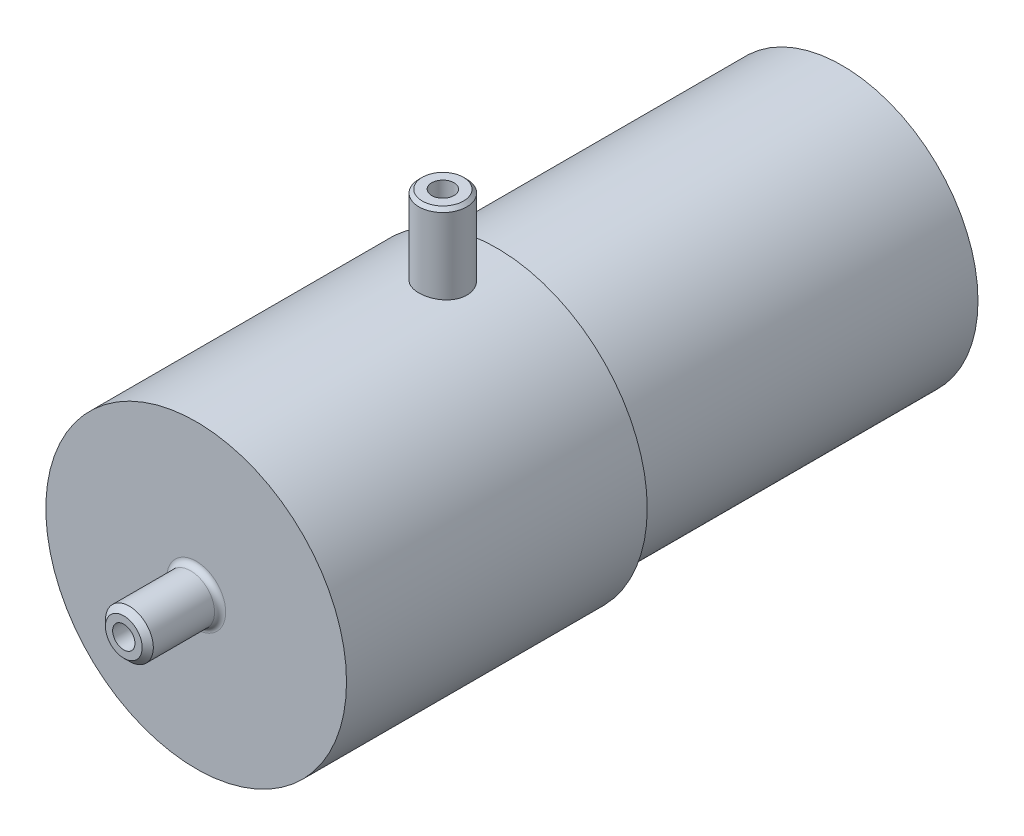
ISO-10303-21;
HEADER;
FILE_DESCRIPTION(('STEP AP214'),'2;1');
FILE_NAME('part.step','',(''),(''),'','','');
FILE_SCHEMA(('AUTOMOTIVE_DESIGN { 1 0 10303 214 1 1 1 1 }'));
ENDSEC;
DATA;
#1=APPLICATION_CONTEXT('core data for automotive mechanical design processes');
#2=APPLICATION_PROTOCOL_DEFINITION('international standard','automotive_design',2000,#1);
#3=PRODUCT_CONTEXT('',#1,'mechanical');
#4=PRODUCT('Part','Part','',(#3));
#5=PRODUCT_RELATED_PRODUCT_CATEGORY('part','',(#4));
#6=PRODUCT_DEFINITION_FORMATION('','',#4);
#7=PRODUCT_DEFINITION_CONTEXT('part definition',#1,'design');
#8=PRODUCT_DEFINITION('design','',#6,#7);
#9=PRODUCT_DEFINITION_SHAPE('','',#8);
#10=(LENGTH_UNIT() NAMED_UNIT(*) SI_UNIT(.MILLI.,.METRE.));
#11=(NAMED_UNIT(*) PLANE_ANGLE_UNIT() SI_UNIT($,.RADIAN.));
#12=(NAMED_UNIT(*) SI_UNIT($,.STERADIAN.) SOLID_ANGLE_UNIT());
#13=UNCERTAINTY_MEASURE_WITH_UNIT(LENGTH_MEASURE(1.E-05),#10,'distance_accuracy_value','');
#14=(GEOMETRIC_REPRESENTATION_CONTEXT(3) GLOBAL_UNCERTAINTY_ASSIGNED_CONTEXT((#13)) GLOBAL_UNIT_ASSIGNED_CONTEXT((#10,
#11,#12)) REPRESENTATION_CONTEXT('',''));
#15=CARTESIAN_POINT('',(0.,0.,0.));
#16=DIRECTION('',(0.,0.,1.));
#17=DIRECTION('',(1.,0.,0.));
#18=AXIS2_PLACEMENT_3D('',#15,#16,#17);
#19=CARTESIAN_POINT('',(0.,0.,58.));
#20=DIRECTION('',(0.,0.,-1.));
#21=DIRECTION('',(-1.,0.,0.));
#22=AXIS2_PLACEMENT_3D('',#19,#20,#21);
#23=CYLINDRICAL_SURFACE('',#22,13.5);
#24=CARTESIAN_POINT('',(0.,0.,31.));
#25=DIRECTION('',(0.,0.,1.));
#26=DIRECTION('',(1.,0.,0.));
#27=AXIS2_PLACEMENT_3D('',#24,#25,#26);
#28=CIRCLE('',#27,13.5);
#29=CARTESIAN_POINT('',(13.5,0.,31.));
#30=VERTEX_POINT('',#29);
#31=EDGE_CURVE('E320',#30,#30,#28,.T.);
#32=ORIENTED_EDGE('',*,*,#31,.T.);
#33=EDGE_LOOP('',(#32));
#34=FACE_BOUND('',#33,.T.);
#35=CARTESIAN_POINT('',(0.,0.,58.));
#36=DIRECTION('',(0.,0.,1.));
#37=DIRECTION('',(1.,0.,0.));
#38=AXIS2_PLACEMENT_3D('',#35,#36,#37);
#39=CIRCLE('',#38,13.5);
#40=CARTESIAN_POINT('',(13.5,0.,58.));
#41=VERTEX_POINT('',#40);
#42=EDGE_CURVE('E322',#41,#41,#39,.T.);
#43=ORIENTED_EDGE('',*,*,#42,.F.);
#44=EDGE_LOOP('',(#43));
#45=FACE_BOUND('',#44,.T.);
#46=CARTESIAN_POINT('',(0.,13.5,33.7));
#47=CARTESIAN_POINT('',(-0.119952809133171,13.4999979999569,33.7000048747845));
#48=CARTESIAN_POINT('',(-0.239972977831815,13.4983845585153,33.7100725135454));
#49=CARTESIAN_POINT('',(-0.476652354362134,13.4921035475326,33.7500633173762));
#50=CARTESIAN_POINT('',(-0.593308279750929,13.4874330940008,33.7800052322495));
#51=CARTESIAN_POINT('',(-0.819800217368557,13.4755623697325,33.8588219826196));
#52=CARTESIAN_POINT('',(-0.929641535951264,13.4683640971887,33.9076818669423));
#53=CARTESIAN_POINT('',(-1.13955142494573,13.452231001861,34.022909626421));
#54=CARTESIAN_POINT('',(-1.23962121992419,13.443296397095,34.0892753038839));
#55=CARTESIAN_POINT('',(-1.42803959226029,13.4245949708515,34.2382498398206));
#56=CARTESIAN_POINT('',(-1.51629012653899,13.4148221740761,34.3209819632055));
#57=CARTESIAN_POINT('',(-1.67771841831363,13.395592023183,34.5000756241129));
#58=CARTESIAN_POINT('',(-1.75089526386707,13.3861346881794,34.596437985656));
#59=CARTESIAN_POINT('',(-1.88048678836292,13.3685483542588,34.8007235862782));
#60=CARTESIAN_POINT('',(-1.93680546237521,13.3604270777147,34.9087084501253));
#61=CARTESIAN_POINT('',(-2.03046821697903,13.3465147084928,35.1327561859491));
#62=CARTESIAN_POINT('',(-2.0678134653956,13.3407234724043,35.2488185602505));
#63=CARTESIAN_POINT('',(-2.12216235954814,13.3321860522297,35.4846910695145));
#64=CARTESIAN_POINT('',(-2.13933464159903,13.3294146382375,35.6044614177109));
#65=CARTESIAN_POINT('',(-2.15337280373593,13.3271542112433,35.8452132160139));
#66=CARTESIAN_POINT('',(-2.15023999653645,13.3276649860492,35.9661945873235));
#67=CARTESIAN_POINT('',(-2.12389447491068,13.3318881732815,36.2047361553467));
#68=CARTESIAN_POINT('',(-2.10087045616485,13.3355704981632,36.3223178022353));
#69=CARTESIAN_POINT('',(-2.03569186706059,13.3456748282717,36.551927549538));
#70=CARTESIAN_POINT('',(-1.99353669285036,13.3520969199755,36.6639554745318));
#71=CARTESIAN_POINT('',(-1.89109885932597,13.366990013494,36.879846822507));
#72=CARTESIAN_POINT('',(-1.83073712754366,13.3754699205053,36.9836720870268));
#73=CARTESIAN_POINT('',(-1.69365584541426,13.3935168772737,37.1797917695161));
#74=CARTESIAN_POINT('',(-1.61693508729202,13.4030840072753,37.27208533531));
#75=CARTESIAN_POINT('',(-1.44828195791586,13.4223599777702,37.4436146269284));
#76=CARTESIAN_POINT('',(-1.3561875332371,13.4320691981937,37.5226910606326));
#77=CARTESIAN_POINT('',(-1.15995130279865,13.4504352491775,37.6642912102996));
#78=CARTESIAN_POINT('',(-1.0558094314133,13.4590920740046,37.7268148360886));
#79=CARTESIAN_POINT('',(-0.838290089350534,13.4743887071867,37.8335461588054));
#80=CARTESIAN_POINT('',(-0.724906004691724,13.4810270547062,37.8777405987032));
#81=CARTESIAN_POINT('',(-0.492195720466629,13.491526836143,37.9464154835777));
#82=CARTESIAN_POINT('',(-0.372869975039293,13.4953884819448,37.9708974327906));
#83=CARTESIAN_POINT('',(-0.133037382667766,13.4998714622971,37.9992383298685));
#84=CARTESIAN_POINT('',(-0.0125570131962313,13.5005271763892,38.0033160977909));
#85=CARTESIAN_POINT('',(0.227366153742994,13.4986183107035,37.9913150893075));
#86=CARTESIAN_POINT('',(0.346808987405594,13.4960538437212,37.9752370189139));
#87=CARTESIAN_POINT('',(0.580596622409703,13.4880140323558,37.923562720145));
#88=CARTESIAN_POINT('',(0.694965793946832,13.4825547320271,37.888074037533));
#89=CARTESIAN_POINT('',(0.916130991673456,13.4693351303052,37.7986999901199));
#90=CARTESIAN_POINT('',(1.02292662345116,13.4615747091841,37.7448136680623));
#91=CARTESIAN_POINT('',(1.22686905427121,13.4445290651743,37.6196672432698));
#92=CARTESIAN_POINT('',(1.32393037034303,13.4352319611546,37.5482694837019));
#93=CARTESIAN_POINT('',(1.5047717337468,13.4161822365033,37.3903173078716));
#94=CARTESIAN_POINT('',(1.58855090437547,13.4064295858577,37.3037618919037));
#95=CARTESIAN_POINT('',(1.7412541215767,13.3874577638751,37.1169732545224));
#96=CARTESIAN_POINT('',(1.81003084550825,13.3782444812819,37.0166189031727));
#97=CARTESIAN_POINT('',(1.92975018518513,13.3615019247082,36.8056529556031));
#98=CARTESIAN_POINT('',(1.98069332942526,13.3539726008263,36.6950416634686));
#99=CARTESIAN_POINT('',(2.06307541513004,13.3414939482433,36.4671261012935));
#100=CARTESIAN_POINT('',(2.09458960121135,13.3365346782746,36.3498495977074));
#101=CARTESIAN_POINT('',(2.13745726467579,13.329732015058,36.1115828190783));
#102=CARTESIAN_POINT('',(2.1488123286041,13.3278883766071,35.9905928370525));
#103=CARTESIAN_POINT('',(2.15099813285312,13.3275356499541,35.7498033980252));
#104=CARTESIAN_POINT('',(2.14206064281668,13.3289889063968,35.630006036421));
#105=CARTESIAN_POINT('',(2.10441415113311,13.3349840131223,35.3936421140549));
#106=CARTESIAN_POINT('',(2.07570519808222,13.3395258558138,35.2770755453527));
#107=CARTESIAN_POINT('',(1.9994164250456,13.3511725947861,35.0505601564542));
#108=CARTESIAN_POINT('',(1.95185485086285,13.3582750123109,34.9406050557477));
#109=CARTESIAN_POINT('',(1.83923436928293,13.3742453055144,34.7301974366002));
#110=CARTESIAN_POINT('',(1.77417471879539,13.3831132561659,34.6297453219671));
#111=CARTESIAN_POINT('',(1.62757087159647,13.4017355812538,34.4400211123902));
#112=CARTESIAN_POINT('',(1.54585562269201,13.4114985227014,34.3508820166091));
#113=CARTESIAN_POINT('',(1.36862146263607,13.4307410133641,34.1875007834045));
#114=CARTESIAN_POINT('',(1.27309936108612,13.4402204964667,34.1132620985685));
#115=CARTESIAN_POINT('',(1.07025587177036,13.4578962878499,33.9813687292189));
#116=CARTESIAN_POINT('',(0.962864423439742,13.4660841998681,33.9238206712093));
#117=CARTESIAN_POINT('',(0.739855784927683,13.480172386128,33.8276677183054));
#118=CARTESIAN_POINT('',(0.624247074173436,13.4860749791747,33.7890436115512));
#119=CARTESIAN_POINT('',(0.42346391757744,13.4936121804413,33.7403922500143));
#120=CARTESIAN_POINT('',(0.33951580264954,13.4959950394117,33.7252689033855));
#121=CARTESIAN_POINT('',(0.170389776955869,13.4991896478639,33.7050711218746));
#122=CARTESIAN_POINT('',(0.085211884558297,13.5000014207874,33.6999965370584));
#123=CARTESIAN_POINT('',(0.,13.5,33.7));
#124=B_SPLINE_CURVE_WITH_KNOTS('',3,(#46,#47,#48,#49,#50,#51,#52,#53,#54,#55,#56,#57,#58,#59,
#60,#61,#62,#63,#64,#65,#66,#67,#68,#69,#70,#71,#72,#73,#74,#75,#76,#77,#78,#79,#80,#81,#82,#83,
#84,#85,#86,#87,#88,#89,#90,#91,#92,#93,#94,#95,#96,#97,#98,#99,#100,#101,#102,#103,#104,#105,
#106,#107,#108,#109,#110,#111,#112,#113,#114,#115,#116,#117,#118,#119,#120,#121,#122,#123),
.UNSPECIFIED.,.T.,.F.,(4,2,2,2,2,2,2,2,2,2,2,2,2,2,2,2,2,2,2,2,2,2,2,2,2,2,2,2,2,2,2,2,2,2,2,2,
2,2,4),(0.,0.359546999810706,0.719433686739561,1.07903652811447,1.43859424609183,
1.80097083929958,2.16336934947984,2.52779403387423,2.89219628500572,3.25353012750805,
3.61484061017977,3.97276073545137,4.33069215882491,4.69020105379991,5.04973650025373,
5.41333359474306,5.77693266993678,6.14079427031468,6.5046281022218,6.86455158964924,
7.2244624701448,7.58239914891921,7.94035445450969,8.30121927963249,8.6621079141449,
9.02639508985964,9.39067146907771,9.75352806512175,10.1163561026844,10.4750610048949,
10.8337650254485,11.1921227320769,11.5504956594766,11.912753458421,12.2750950997819,
12.6397029603426,13.0039398949347,13.2593581282162,13.514772550459),.UNSPECIFIED.);
#125=CARTESIAN_POINT('',(0.,13.5,33.7));
#126=VERTEX_POINT('',#125);
#127=EDGE_CURVE('E66',#126,#126,#124,.T.);
#128=ORIENTED_EDGE('',*,*,#127,.F.);
#129=EDGE_LOOP('',(#128));
#130=FACE_BOUND('',#129,.T.);
#131=ADVANCED_FACE('F43',(#34,#45,#130),#23,.T.);
#132=CARTESIAN_POINT('',(0.,0.,31.));
#133=DIRECTION('',(0.,0.,-1.));
#134=DIRECTION('',(-1.,0.,0.));
#135=AXIS2_PLACEMENT_3D('',#132,#133,#134);
#136=CYLINDRICAL_SURFACE('',#135,12.2);
#137=CARTESIAN_POINT('',(0.,0.,31.));
#138=DIRECTION('',(0.,0.,1.));
#139=DIRECTION('',(1.,0.,0.));
#140=AXIS2_PLACEMENT_3D('',#137,#138,#139);
#141=CIRCLE('',#140,12.2);
#142=CARTESIAN_POINT('',(12.2,0.,31.));
#143=VERTEX_POINT('',#142);
#144=EDGE_CURVE('E327',#143,#143,#141,.T.);
#145=ORIENTED_EDGE('',*,*,#144,.F.);
#146=EDGE_LOOP('',(#145));
#147=FACE_BOUND('',#146,.T.);
#148=CARTESIAN_POINT('',(0.,0.,0.));
#149=DIRECTION('',(0.,0.,1.));
#150=DIRECTION('',(1.,0.,0.));
#151=AXIS2_PLACEMENT_3D('',#148,#149,#150);
#152=CIRCLE('',#151,12.2);
#153=CARTESIAN_POINT('',(12.2,0.,0.));
#154=VERTEX_POINT('',#153);
#155=EDGE_CURVE('E325',#154,#154,#152,.T.);
#156=ORIENTED_EDGE('',*,*,#155,.T.);
#157=EDGE_LOOP('',(#156));
#158=FACE_BOUND('',#157,.T.);
#159=ADVANCED_FACE('F114',(#147,#158),#136,.T.);
#160=CARTESIAN_POINT('',(0.,0.,0.));
#161=DIRECTION('',(0.,0.,1.));
#162=DIRECTION('',(1.,0.,0.));
#163=AXIS2_PLACEMENT_3D('',#160,#161,#162);
#164=PLANE('',#163);
#165=CARTESIAN_POINT('',(0.,0.,0.));
#166=DIRECTION('',(0.,0.,-1.));
#167=DIRECTION('',(-1.,0.,0.));
#168=AXIS2_PLACEMENT_3D('',#165,#166,#167);
#169=CIRCLE('',#168,3.);
#170=CARTESIAN_POINT('',(-3.,0.,0.));
#171=VERTEX_POINT('',#170);
#172=EDGE_CURVE('E54',#171,#171,#169,.T.);
#173=ORIENTED_EDGE('',*,*,#172,.F.);
#174=EDGE_LOOP('',(#173));
#175=FACE_BOUND('',#174,.T.);
#176=ORIENTED_EDGE('',*,*,#155,.F.);
#177=EDGE_LOOP('',(#176));
#178=FACE_BOUND('',#177,.T.);
#179=ADVANCED_FACE('F105',(#175,#178),#164,.F.);
#180=CARTESIAN_POINT('',(0.,0.,58.));
#181=DIRECTION('',(0.,0.,1.));
#182=DIRECTION('',(1.,0.,0.));
#183=AXIS2_PLACEMENT_3D('',#180,#181,#182);
#184=PLANE('',#183);
#185=CARTESIAN_POINT('',(0.,0.,58.));
#186=DIRECTION('',(0.,0.,1.));
#187=DIRECTION('',(1.,0.,0.));
#188=AXIS2_PLACEMENT_3D('',#185,#186,#187);
#189=CIRCLE('',#188,2.65);
#190=CARTESIAN_POINT('',(2.65,0.,58.));
#191=VERTEX_POINT('',#190);
#192=EDGE_CURVE('E74',#191,#191,#189,.F.);
#193=ORIENTED_EDGE('',*,*,#192,.T.);
#194=EDGE_LOOP('',(#193));
#195=FACE_BOUND('',#194,.T.);
#196=ORIENTED_EDGE('',*,*,#42,.T.);
#197=EDGE_LOOP('',(#196));
#198=FACE_BOUND('',#197,.T.);
#199=ADVANCED_FACE('F103',(#195,#198),#184,.T.);
#200=CARTESIAN_POINT('',(0.,0.,31.));
#201=DIRECTION('',(0.,0.,1.));
#202=DIRECTION('',(1.,0.,0.));
#203=AXIS2_PLACEMENT_3D('',#200,#201,#202);
#204=PLANE('',#203);
#205=ORIENTED_EDGE('',*,*,#144,.T.);
#206=EDGE_LOOP('',(#205));
#207=FACE_BOUND('',#206,.T.);
#208=ORIENTED_EDGE('',*,*,#31,.F.);
#209=EDGE_LOOP('',(#208));
#210=FACE_BOUND('',#209,.T.);
#211=ADVANCED_FACE('F98',(#207,#210),#204,.F.);
#212=CARTESIAN_POINT('',(0.,0.,64.5));
#213=DIRECTION('',(0.,0.,1.));
#214=DIRECTION('',(1.,0.,0.));
#215=AXIS2_PLACEMENT_3D('',#212,#213,#214);
#216=PLANE('',#215);
#217=CARTESIAN_POINT('',(0.,0.,64.5));
#218=DIRECTION('',(0.,0.,1.));
#219=DIRECTION('',(1.,0.,0.));
#220=AXIS2_PLACEMENT_3D('',#217,#218,#219);
#221=CIRCLE('',#220,1.65000000000005);
#222=CARTESIAN_POINT('',(1.65000000000005,0.,64.5));
#223=VERTEX_POINT('',#222);
#224=EDGE_CURVE('E329',#223,#223,#221,.T.);
#225=ORIENTED_EDGE('',*,*,#224,.T.);
#226=EDGE_LOOP('',(#225));
#227=FACE_BOUND('',#226,.T.);
#228=CARTESIAN_POINT('',(0.,0.,64.5));
#229=DIRECTION('',(0.,0.,1.));
#230=DIRECTION('',(1.,0.,0.));
#231=AXIS2_PLACEMENT_3D('',#228,#229,#230);
#232=CIRCLE('',#231,1.);
#233=CARTESIAN_POINT('',(-1.,0.,64.5));
#234=VERTEX_POINT('',#233);
#235=EDGE_CURVE('E317',#234,#234,#232,.T.);
#236=ORIENTED_EDGE('',*,*,#235,.F.);
#237=EDGE_LOOP('',(#236));
#238=FACE_BOUND('',#237,.T.);
#239=ADVANCED_FACE('F95',(#227,#238),#216,.T.);
#240=CARTESIAN_POINT('',(0.,0.,64.5));
#241=DIRECTION('',(0.,0.,-1.));
#242=DIRECTION('',(-1.,0.,0.));
#243=AXIS2_PLACEMENT_3D('',#240,#241,#242);
#244=CYLINDRICAL_SURFACE('',#243,2.15);
#245=CARTESIAN_POINT('',(0.,0.,58.5));
#246=DIRECTION('',(0.,0.,1.));
#247=DIRECTION('',(1.,0.,0.));
#248=AXIS2_PLACEMENT_3D('',#245,#246,#247);
#249=CIRCLE('',#248,2.15);
#250=CARTESIAN_POINT('',(-2.15,0.,58.5));
#251=VERTEX_POINT('',#250);
#252=EDGE_CURVE('E336',#251,#251,#249,.T.);
#253=CARTESIAN_POINT('',(0.,0.,64.));
#254=DIRECTION('',(0.,0.,1.));
#255=DIRECTION('',(1.,0.,0.));
#256=AXIS2_PLACEMENT_3D('',#253,#254,#255);
#257=CIRCLE('',#256,2.15);
#258=CARTESIAN_POINT('',(-2.15,0.,64.));
#259=VERTEX_POINT('',#258);
#260=EDGE_CURVE('E334',#259,#259,#257,.F.);
#261=CARTESIAN_POINT('',(-2.15,0.,58.5));
#262=CARTESIAN_POINT('',(-2.15,0.,58.5572916666667));
#263=CARTESIAN_POINT('',(-2.15,0.,58.6145833333333));
#264=CARTESIAN_POINT('',(-2.15,0.,58.7291666666667));
#265=CARTESIAN_POINT('',(-2.15,0.,58.7864583333333));
#266=CARTESIAN_POINT('',(-2.15,0.,58.9010416666667));
#267=CARTESIAN_POINT('',(-2.15,0.,58.9583333333333));
#268=CARTESIAN_POINT('',(-2.15,0.,59.0729166666667));
#269=CARTESIAN_POINT('',(-2.15,0.,59.1302083333333));
#270=CARTESIAN_POINT('',(-2.15,0.,59.2447916666667));
#271=CARTESIAN_POINT('',(-2.15,0.,59.3020833333333));
#272=CARTESIAN_POINT('',(-2.15,0.,59.4166666666667));
#273=CARTESIAN_POINT('',(-2.15,0.,59.4739583333333));
#274=CARTESIAN_POINT('',(-2.15,0.,59.5885416666667));
#275=CARTESIAN_POINT('',(-2.15,0.,59.6458333333333));
#276=CARTESIAN_POINT('',(-2.15,0.,59.7604166666667));
#277=CARTESIAN_POINT('',(-2.15,0.,59.8177083333333));
#278=CARTESIAN_POINT('',(-2.15,0.,59.9322916666667));
#279=CARTESIAN_POINT('',(-2.15,0.,59.9895833333333));
#280=CARTESIAN_POINT('',(-2.15,0.,60.1041666666667));
#281=CARTESIAN_POINT('',(-2.15,0.,60.1614583333333));
#282=CARTESIAN_POINT('',(-2.15,0.,60.2760416666667));
#283=CARTESIAN_POINT('',(-2.15,0.,60.3333333333333));
#284=CARTESIAN_POINT('',(-2.15,0.,60.4479166666667));
#285=CARTESIAN_POINT('',(-2.15,0.,60.5052083333333));
#286=CARTESIAN_POINT('',(-2.15,0.,60.6197916666667));
#287=CARTESIAN_POINT('',(-2.15,0.,60.6770833333333));
#288=CARTESIAN_POINT('',(-2.15,0.,60.7916666666667));
#289=CARTESIAN_POINT('',(-2.15,0.,60.8489583333333));
#290=CARTESIAN_POINT('',(-2.15,0.,60.9635416666667));
#291=CARTESIAN_POINT('',(-2.15,0.,61.0208333333333));
#292=CARTESIAN_POINT('',(-2.15,0.,61.1354166666667));
#293=CARTESIAN_POINT('',(-2.15,0.,61.1927083333333));
#294=CARTESIAN_POINT('',(-2.15,0.,61.3072916666667));
#295=CARTESIAN_POINT('',(-2.15,0.,61.3645833333333));
#296=CARTESIAN_POINT('',(-2.15,0.,61.4791666666667));
#297=CARTESIAN_POINT('',(-2.15,0.,61.5364583333333));
#298=CARTESIAN_POINT('',(-2.15,0.,61.6510416666667));
#299=CARTESIAN_POINT('',(-2.15,0.,61.7083333333333));
#300=CARTESIAN_POINT('',(-2.15,0.,61.8229166666667));
#301=CARTESIAN_POINT('',(-2.15,0.,61.8802083333333));
#302=CARTESIAN_POINT('',(-2.15,0.,61.9947916666667));
#303=CARTESIAN_POINT('',(-2.15,0.,62.0520833333334));
#304=CARTESIAN_POINT('',(-2.15,0.,62.1666666666667));
#305=CARTESIAN_POINT('',(-2.15,0.,62.2239583333334));
#306=CARTESIAN_POINT('',(-2.15,0.,62.3385416666667));
#307=CARTESIAN_POINT('',(-2.15,0.,62.3958333333334));
#308=CARTESIAN_POINT('',(-2.15,0.,62.5104166666667));
#309=CARTESIAN_POINT('',(-2.15,0.,62.5677083333334));
#310=CARTESIAN_POINT('',(-2.15,0.,62.6822916666667));
#311=CARTESIAN_POINT('',(-2.15,0.,62.7395833333334));
#312=CARTESIAN_POINT('',(-2.15,0.,62.8541666666667));
#313=CARTESIAN_POINT('',(-2.15,0.,62.9114583333334));
#314=CARTESIAN_POINT('',(-2.15,0.,63.0260416666667));
#315=CARTESIAN_POINT('',(-2.15,0.,63.0833333333334));
#316=CARTESIAN_POINT('',(-2.15,0.,63.1979166666667));
#317=CARTESIAN_POINT('',(-2.15,0.,63.2552083333334));
#318=CARTESIAN_POINT('',(-2.15,0.,63.3697916666667));
#319=CARTESIAN_POINT('',(-2.15,0.,63.4270833333334));
#320=CARTESIAN_POINT('',(-2.15,0.,63.5416666666667));
#321=CARTESIAN_POINT('',(-2.15,0.,63.5989583333334));
#322=CARTESIAN_POINT('',(-2.15,0.,63.7135416666667));
#323=CARTESIAN_POINT('',(-2.15,0.,63.7708333333334));
#324=CARTESIAN_POINT('',(-2.15,0.,63.8854166666667));
#325=CARTESIAN_POINT('',(-2.15,0.,63.9427083333334));
#326=CARTESIAN_POINT('',(-2.15,0.,64.));
#327=B_SPLINE_CURVE_WITH_KNOTS('',3,(#261,#262,#263,#264,#265,#266,#267,#268,#269,#270,#271,
#272,#273,#274,#275,#276,#277,#278,#279,#280,#281,#282,#283,#284,#285,#286,#287,#288,#289,#290,
#291,#292,#293,#294,#295,#296,#297,#298,#299,#300,#301,#302,#303,#304,#305,#306,#307,#308,#309,
#310,#311,#312,#313,#314,#315,#316,#317,#318,#319,#320,#321,#322,#323,#324,#325,#326),
.UNSPECIFIED.,.F.,.F.,(4,2,2,2,2,2,2,2,2,2,2,2,2,2,2,2,2,2,2,2,2,2,2,2,2,2,2,2,2,2,2,2,4),(0.,
0.171875000000002,0.343750000000004,0.515625000000006,0.687500000000008,0.859375000000009,
1.03125000000001,1.20312500000001,1.37500000000002,1.54687500000002,1.71875000000002,
1.89062500000002,2.06250000000002,2.23437500000002,2.40625000000002,2.57812500000002,
2.75000000000002,2.92187500000003,3.09375000000003,3.26562500000003,3.43750000000003,
3.60937500000003,3.78125000000003,3.95312500000004,4.12500000000004,4.29687500000004,
4.46875000000004,4.64062500000004,4.81250000000005,4.98437500000005,5.15625000000005,
5.32812500000005,5.50000000000005),.UNSPECIFIED.);
#328=EDGE_CURVE('BSEAM93',#251,#259,#327,.T.);
#329=ORIENTED_EDGE('',*,*,#252,.T.);
#330=ORIENTED_EDGE('',*,*,#260,.T.);
#331=ORIENTED_EDGE('',*,*,#328,.T.);
#332=ORIENTED_EDGE('',*,*,#328,.F.);
#333=EDGE_LOOP('',(#329,#331,#330,#332));
#334=FACE_BOUND('',#333,.T.);
#335=ADVANCED_FACE('F93',(#334),#244,.T.);
#336=CARTESIAN_POINT('',(0.,0.,64.5));
#337=DIRECTION('',(0.,0.,-1.));
#338=DIRECTION('',(-1.,0.,0.));
#339=AXIS2_PLACEMENT_3D('',#336,#337,#338);
#340=CYLINDRICAL_SURFACE('',#339,1.);
#341=CARTESIAN_POINT('',(0.,0.,58.));
#342=DIRECTION('',(0.,0.,1.));
#343=DIRECTION('',(1.,0.,0.));
#344=AXIS2_PLACEMENT_3D('',#341,#342,#343);
#345=CIRCLE('',#344,1.);
#346=CARTESIAN_POINT('',(-1.,0.,58.));
#347=VERTEX_POINT('',#346);
#348=EDGE_CURVE('E140',#347,#347,#345,.T.);
#349=CARTESIAN_POINT('',(-1.,0.,64.5));
#350=CARTESIAN_POINT('',(-1.,0.,64.4322916666667));
#351=CARTESIAN_POINT('',(-1.,0.,64.3645833333333));
#352=CARTESIAN_POINT('',(-1.,0.,64.2291666666667));
#353=CARTESIAN_POINT('',(-1.,0.,64.1614583333333));
#354=CARTESIAN_POINT('',(-1.,0.,64.0260416666667));
#355=CARTESIAN_POINT('',(-1.,0.,63.9583333333333));
#356=CARTESIAN_POINT('',(-1.,0.,63.8229166666667));
#357=CARTESIAN_POINT('',(-1.,0.,63.7552083333333));
#358=CARTESIAN_POINT('',(-1.,0.,63.6197916666667));
#359=CARTESIAN_POINT('',(-1.,0.,63.5520833333333));
#360=CARTESIAN_POINT('',(-1.,0.,63.4166666666667));
#361=CARTESIAN_POINT('',(-1.,0.,63.3489583333333));
#362=CARTESIAN_POINT('',(-1.,0.,63.2135416666667));
#363=CARTESIAN_POINT('',(-1.,0.,63.1458333333333));
#364=CARTESIAN_POINT('',(-1.,0.,63.0104166666667));
#365=CARTESIAN_POINT('',(-1.,0.,62.9427083333333));
#366=CARTESIAN_POINT('',(-1.,0.,62.8072916666667));
#367=CARTESIAN_POINT('',(-1.,0.,62.7395833333333));
#368=CARTESIAN_POINT('',(-1.,0.,62.6041666666667));
#369=CARTESIAN_POINT('',(-1.,0.,62.5364583333333));
#370=CARTESIAN_POINT('',(-1.,0.,62.4010416666667));
#371=CARTESIAN_POINT('',(-1.,0.,62.3333333333333));
#372=CARTESIAN_POINT('',(-1.,0.,62.1979166666667));
#373=CARTESIAN_POINT('',(-1.,0.,62.1302083333333));
#374=CARTESIAN_POINT('',(-1.,0.,61.9947916666667));
#375=CARTESIAN_POINT('',(-1.,0.,61.9270833333333));
#376=CARTESIAN_POINT('',(-1.,0.,61.7916666666667));
#377=CARTESIAN_POINT('',(-1.,0.,61.7239583333333));
#378=CARTESIAN_POINT('',(-1.,0.,61.5885416666667));
#379=CARTESIAN_POINT('',(-1.,0.,61.5208333333333));
#380=CARTESIAN_POINT('',(-1.,0.,61.3854166666667));
#381=CARTESIAN_POINT('',(-1.,0.,61.3177083333333));
#382=CARTESIAN_POINT('',(-1.,0.,61.1822916666667));
#383=CARTESIAN_POINT('',(-1.,0.,61.1145833333333));
#384=CARTESIAN_POINT('',(-1.,0.,60.9791666666667));
#385=CARTESIAN_POINT('',(-1.,0.,60.9114583333333));
#386=CARTESIAN_POINT('',(-1.,0.,60.7760416666667));
#387=CARTESIAN_POINT('',(-1.,0.,60.7083333333333));
#388=CARTESIAN_POINT('',(-1.,0.,60.5729166666667));
#389=CARTESIAN_POINT('',(-1.,0.,60.5052083333333));
#390=CARTESIAN_POINT('',(-1.,0.,60.3697916666667));
#391=CARTESIAN_POINT('',(-1.,0.,60.3020833333333));
#392=CARTESIAN_POINT('',(-1.,0.,60.1666666666667));
#393=CARTESIAN_POINT('',(-1.,0.,60.0989583333333));
#394=CARTESIAN_POINT('',(-1.,0.,59.9635416666667));
#395=CARTESIAN_POINT('',(-1.,0.,59.8958333333333));
#396=CARTESIAN_POINT('',(-1.,0.,59.7604166666667));
#397=CARTESIAN_POINT('',(-1.,0.,59.6927083333333));
#398=CARTESIAN_POINT('',(-1.,0.,59.5572916666667));
#399=CARTESIAN_POINT('',(-1.,0.,59.4895833333333));
#400=CARTESIAN_POINT('',(-1.,0.,59.3541666666667));
#401=CARTESIAN_POINT('',(-1.,0.,59.2864583333333));
#402=CARTESIAN_POINT('',(-1.,0.,59.1510416666667));
#403=CARTESIAN_POINT('',(-1.,0.,59.0833333333333));
#404=CARTESIAN_POINT('',(-1.,0.,58.9479166666667));
#405=CARTESIAN_POINT('',(-1.,0.,58.8802083333333));
#406=CARTESIAN_POINT('',(-1.,0.,58.7447916666667));
#407=CARTESIAN_POINT('',(-1.,0.,58.6770833333333));
#408=CARTESIAN_POINT('',(-1.,0.,58.5416666666667));
#409=CARTESIAN_POINT('',(-1.,0.,58.4739583333333));
#410=CARTESIAN_POINT('',(-1.,0.,58.3385416666667));
#411=CARTESIAN_POINT('',(-1.,0.,58.2708333333333));
#412=CARTESIAN_POINT('',(-1.,0.,58.1354166666667));
#413=CARTESIAN_POINT('',(-1.,0.,58.0677083333333));
#414=CARTESIAN_POINT('',(-1.,0.,58.));
#415=B_SPLINE_CURVE_WITH_KNOTS('',3,(#349,#350,#351,#352,#353,#354,#355,#356,#357,#358,#359,
#360,#361,#362,#363,#364,#365,#366,#367,#368,#369,#370,#371,#372,#373,#374,#375,#376,#377,#378,
#379,#380,#381,#382,#383,#384,#385,#386,#387,#388,#389,#390,#391,#392,#393,#394,#395,#396,#397,
#398,#399,#400,#401,#402,#403,#404,#405,#406,#407,#408,#409,#410,#411,#412,#413,#414),
.UNSPECIFIED.,.F.,.F.,(4,2,2,2,2,2,2,2,2,2,2,2,2,2,2,2,2,2,2,2,2,2,2,2,2,2,2,2,2,2,2,2,4),(0.,
0.203124999999998,0.406249999999997,0.609374999999995,0.812499999999994,1.01562499999999,
1.21874999999999,1.42187499999999,1.62499999999999,1.828125,2.03124999999999,2.234375,2.4375,
2.64062499999999,2.84374999999999,3.046875,3.25,3.45312499999999,3.65624999999999,3.859375,
4.0625,4.26562499999999,4.46874999999999,4.67187499999999,4.875,5.078125,5.28124999999999,
5.48437499999999,5.6875,5.890625,6.09374999999999,6.29687499999999,6.5),.UNSPECIFIED.);
#416=EDGE_CURVE('BSEAM89',#234,#347,#415,.T.);
#417=ORIENTED_EDGE('',*,*,#235,.T.);
#418=ORIENTED_EDGE('',*,*,#348,.F.);
#419=ORIENTED_EDGE('',*,*,#416,.T.);
#420=ORIENTED_EDGE('',*,*,#416,.F.);
#421=EDGE_LOOP('',(#417,#419,#418,#420));
#422=FACE_BOUND('',#421,.T.);
#423=ADVANCED_FACE('F89',(#422),#340,.F.);
#424=ORIENTED_EDGE('',*,*,#348,.T.);
#425=EDGE_LOOP('',(#424));
#426=FACE_BOUND('',#425,.T.);
#427=ADVANCED_FACE('F92',(#426),#184,.T.);
#428=CARTESIAN_POINT('',(0.,0.,64.5));
#429=DIRECTION('',(0.,0.,-1.));
#430=DIRECTION('',(-1.,0.,0.));
#431=AXIS2_PLACEMENT_3D('',#428,#429,#430);
#432=CONICAL_SURFACE('',#431,1.65000000000005,0.785398163397442);
#433=ORIENTED_EDGE('',*,*,#260,.F.);
#434=EDGE_LOOP('',(#433));
#435=FACE_BOUND('',#434,.T.);
#436=ORIENTED_EDGE('',*,*,#224,.F.);
#437=EDGE_LOOP('',(#436));
#438=FACE_BOUND('',#437,.T.);
#439=ADVANCED_FACE('F241',(#435,#438),#432,.T.);
#440=CARTESIAN_POINT('',(0.,0.,58.5));
#441=DIRECTION('',(0.,0.,1.));
#442=DIRECTION('',(1.,0.,0.));
#443=AXIS2_PLACEMENT_3D('',#440,#441,#442);
#444=TOROIDAL_SURFACE('',#443,2.65,0.5);
#445=ORIENTED_EDGE('',*,*,#192,.F.);
#446=EDGE_LOOP('',(#445));
#447=FACE_BOUND('',#446,.T.);
#448=ORIENTED_EDGE('',*,*,#252,.F.);
#449=EDGE_LOOP('',(#448));
#450=FACE_BOUND('',#449,.T.);
#451=ADVANCED_FACE('F213',(#447,#450),#444,.F.);
#452=CARTESIAN_POINT('',(0.,20.5,35.85));
#453=DIRECTION('',(0.,1.,0.));
#454=DIRECTION('',(0.,0.,1.));
#455=AXIS2_PLACEMENT_3D('',#452,#453,#454);
#456=PLANE('',#455);
#457=CARTESIAN_POINT('',(0.,20.5,35.85));
#458=DIRECTION('',(0.,1.,0.));
#459=DIRECTION('',(0.,0.,1.));
#460=AXIS2_PLACEMENT_3D('',#457,#458,#459);
#461=CIRCLE('',#460,1.84999999999998);
#462=CARTESIAN_POINT('',(0.,20.5,37.7));
#463=VERTEX_POINT('',#462);
#464=EDGE_CURVE('E63',#463,#463,#461,.T.);
#465=ORIENTED_EDGE('',*,*,#464,.T.);
#466=EDGE_LOOP('',(#465));
#467=FACE_BOUND('',#466,.T.);
#468=CARTESIAN_POINT('',(0.,20.5,35.85));
#469=DIRECTION('',(0.,1.,0.));
#470=DIRECTION('',(0.,0.,1.));
#471=AXIS2_PLACEMENT_3D('',#468,#469,#470);
#472=CIRCLE('',#471,1.);
#473=CARTESIAN_POINT('',(0.,20.5,36.85));
#474=VERTEX_POINT('',#473);
#475=EDGE_CURVE('E137',#474,#474,#472,.T.);
#476=ORIENTED_EDGE('',*,*,#475,.F.);
#477=EDGE_LOOP('',(#476));
#478=FACE_BOUND('',#477,.T.);
#479=ADVANCED_FACE('F86',(#467,#478),#456,.T.);
#480=CARTESIAN_POINT('',(0.,20.5,35.85));
#481=DIRECTION('',(0.,-1.,0.));
#482=DIRECTION('',(0.,0.,-1.));
#483=AXIS2_PLACEMENT_3D('',#480,#481,#482);
#484=CYLINDRICAL_SURFACE('',#483,2.15);
#485=CARTESIAN_POINT('',(0.,20.2,35.85));
#486=DIRECTION('',(0.,1.,0.));
#487=DIRECTION('',(0.,0.,1.));
#488=AXIS2_PLACEMENT_3D('',#485,#486,#487);
#489=CIRCLE('',#488,2.15);
#490=CARTESIAN_POINT('',(0.,20.2,38.));
#491=VERTEX_POINT('',#490);
#492=EDGE_CURVE('E58',#491,#491,#489,.F.);
#493=ORIENTED_EDGE('',*,*,#492,.T.);
#494=EDGE_LOOP('',(#493));
#495=FACE_BOUND('',#494,.T.);
#496=ORIENTED_EDGE('',*,*,#127,.T.);
#497=EDGE_LOOP('',(#496));
#498=FACE_BOUND('',#497,.T.);
#499=ADVANCED_FACE('F80',(#495,#498),#484,.T.);
#500=CARTESIAN_POINT('',(0.,20.5,35.85));
#501=DIRECTION('',(0.,-1.,0.));
#502=DIRECTION('',(0.,0.,-1.));
#503=AXIS2_PLACEMENT_3D('',#500,#501,#502);
#504=CYLINDRICAL_SURFACE('',#503,1.);
#505=ORIENTED_EDGE('',*,*,#475,.T.);
#506=EDGE_LOOP('',(#505));
#507=FACE_BOUND('',#506,.T.);
#508=CARTESIAN_POINT('',(0.,13.5,36.85));
#509=CARTESIAN_POINT('',(0.0560879437507621,13.4999995112953,36.8499975412043));
#510=CARTESIAN_POINT('',(0.112214593132421,13.4996467283223,36.845265348836));
#511=CARTESIAN_POINT('',(0.222916480560006,13.4982733245986,36.8264565319657));
#512=CARTESIAN_POINT('',(0.277489862835123,13.4972519373251,36.8123691819536));
#513=CARTESIAN_POINT('',(0.383465781846227,13.4946568065207,36.7752583337775));
#514=CARTESIAN_POINT('',(0.434870036752271,13.4930833654427,36.7522397280351));
#515=CARTESIAN_POINT('',(0.533072314217248,13.4895608267732,36.6979281510833));
#516=CARTESIAN_POINT('',(0.579871352249659,13.4876118122793,36.666637009645));
#517=CARTESIAN_POINT('',(0.667643302036652,13.4835525527616,36.5965991199867));
#518=CARTESIAN_POINT('',(0.708605516479362,13.4814420223292,36.5578389812171));
#519=CARTESIAN_POINT('',(0.78344938466865,13.4773000138992,36.4739914028679));
#520=CARTESIAN_POINT('',(0.81733073478775,13.4752685392945,36.4289036921005));
#521=CARTESIAN_POINT('',(0.877086094217643,13.4715114467936,36.3336176552127));
#522=CARTESIAN_POINT('',(0.902950898004397,13.4697861814861,36.2834135410704));
#523=CARTESIAN_POINT('',(0.945880121953629,13.4668398853279,36.1793602521632));
#524=CARTESIAN_POINT('',(0.962944668289716,13.4656188472478,36.125511129671));
#525=CARTESIAN_POINT('',(0.987758451951508,13.4638214984241,36.0158020783266));
#526=CARTESIAN_POINT('',(0.995524871870944,13.4632439985828,35.9599460555982));
#527=CARTESIAN_POINT('',(1.00157500687875,13.4627952957486,35.8477204401213));
#528=CARTESIAN_POINT('',(0.999858866042837,13.4629240820246,35.7913508551886));
#529=CARTESIAN_POINT('',(0.987006819404356,13.4638723251247,35.6798156682312));
#530=CARTESIAN_POINT('',(0.975889548187163,13.4646904156232,35.6246479057338));
#531=CARTESIAN_POINT('',(0.94457974796959,13.4669229353638,35.5169636250798));
#532=CARTESIAN_POINT('',(0.924387146706019,13.4683373693545,35.464447128038));
#533=CARTESIAN_POINT('',(0.875478876069687,13.4716047667135,35.3634965072652));
#534=CARTESIAN_POINT('',(0.846754801736326,13.4734581621675,35.3150664700975));
#535=CARTESIAN_POINT('',(0.781605028225206,13.4773942226269,35.2237082011351));
#536=CARTESIAN_POINT('',(0.745179206318044,13.4794768912854,35.180780057032));
#537=CARTESIAN_POINT('',(0.665555207623175,13.4836428911915,35.1015357639966));
#538=CARTESIAN_POINT('',(0.622340912876129,13.4857262119278,35.065235807727));
#539=CARTESIAN_POINT('',(0.530423024353945,13.4896539578957,35.0004033676624));
#540=CARTESIAN_POINT('',(0.481719427840155,13.4914983830081,34.9718708877427));
#541=CARTESIAN_POINT('',(0.38019526260804,13.4947407596723,34.9233845135958));
#542=CARTESIAN_POINT('',(0.327374373992182,13.4961386764892,34.9034312867293));
#543=CARTESIAN_POINT('',(0.219119631754086,13.4983300958748,34.8726809042528));
#544=CARTESIAN_POINT('',(0.163685820993016,13.4991236083543,34.8618835985084));
#545=CARTESIAN_POINT('',(0.0519192166388135,13.5000155351179,34.8497717419047));
#546=CARTESIAN_POINT('',(-0.00441113953764086,13.5001155896261,34.848434814419));
#547=CARTESIAN_POINT('',(-0.116495240013602,13.4996136987834,34.8552231188539));
#548=CARTESIAN_POINT('',(-0.172248988545342,13.4990117585887,34.863348281274));
#549=CARTESIAN_POINT('',(-0.281533795333286,13.4971746606957,34.8888115844202));
#550=CARTESIAN_POINT('',(-0.335067271394597,13.4959402124507,34.9061394037691));
#551=CARTESIAN_POINT('',(-0.438466681472669,13.4929768689092,34.9495056347975));
#552=CARTESIAN_POINT('',(-0.488332569375139,13.4912479673969,34.9755441559778));
#553=CARTESIAN_POINT('',(-0.583083433961915,13.487485653145,35.0356492361677));
#554=CARTESIAN_POINT('',(-0.627958947535944,13.4854516784902,35.0697306773083));
#555=CARTESIAN_POINT('',(-0.71135981388001,13.4813098114879,35.1449325745697));
#556=CARTESIAN_POINT('',(-0.749885079364598,13.4792019181248,35.1860531274286));
#557=CARTESIAN_POINT('',(-0.819568158623003,13.4751449771878,35.27426282189));
#558=CARTESIAN_POINT('',(-0.850711410968977,13.4731962484542,35.3213634832746));
#559=CARTESIAN_POINT('',(-0.904646695943775,13.4696825494786,35.4201387772931));
#560=CARTESIAN_POINT('',(-0.927438796808282,13.468117576101,35.47181337255));
#561=CARTESIAN_POINT('',(-0.963999791444961,13.4655502035088,35.5782173434534));
#562=CARTESIAN_POINT('',(-0.977777719163466,13.4645472411955,35.6329436008484));
#563=CARTESIAN_POINT('',(-0.995948720122955,13.4632154573328,35.7439404093508));
#564=CARTESIAN_POINT('',(-1.00034193164927,13.46288662585,35.8002109376905));
#565=CARTESIAN_POINT('',(-0.999617334984282,13.4629404354033,35.9125542425075));
#566=CARTESIAN_POINT('',(-0.994522411124774,13.4633213645763,35.9686271688324));
#567=CARTESIAN_POINT('',(-0.975013759115569,13.4647481406555,36.0791188219643));
#568=CARTESIAN_POINT('',(-0.960600015340106,13.4657939886765,36.1335375459974));
#569=CARTESIAN_POINT('',(-0.922868390139354,13.4684323184909,36.2391784160241));
#570=CARTESIAN_POINT('',(-0.899550780672068,13.4700247835883,36.2904006595947));
#571=CARTESIAN_POINT('',(-0.844676091465755,13.4735769174416,36.3882068299088));
#572=CARTESIAN_POINT('',(-0.813119181224877,13.4755365786433,36.434790852042));
#573=CARTESIAN_POINT('',(-0.742576047850047,13.4796078718083,36.522115020028));
#574=CARTESIAN_POINT('',(-0.703573010499141,13.4817198408519,36.5628415669014));
#575=CARTESIAN_POINT('',(-0.619272618646947,13.4858547523453,36.6371849133329));
#576=CARTESIAN_POINT('',(-0.573973735495025,13.4878776730162,36.6707999811877));
#577=CARTESIAN_POINT('',(-0.478297548292635,13.4916094449029,36.730001346728));
#578=CARTESIAN_POINT('',(-0.427912440315962,13.4933178017776,36.7555750511876));
#579=CARTESIAN_POINT('',(-0.32358629797167,13.4962218325543,36.7978675992703));
#580=CARTESIAN_POINT('',(-0.269649470299675,13.4974181008121,36.8145967136993));
#581=CARTESIAN_POINT('',(-0.179490576539638,13.4988529927646,36.8344225627196));
#582=CARTESIAN_POINT('',(-0.143849812423338,13.4992811847637,36.8402564390513));
#583=CARTESIAN_POINT('',(-0.0721447039137155,13.499854845283,36.8480459446199));
#584=CARTESIAN_POINT('',(-0.0360803603770396,13.5000003143749,36.8500015816988));
#585=CARTESIAN_POINT('',(0.,13.5,36.85));
#586=B_SPLINE_CURVE_WITH_KNOTS('',3,(#508,#509,#510,#511,#512,#513,#514,#515,#516,#517,#518,
#519,#520,#521,#522,#523,#524,#525,#526,#527,#528,#529,#530,#531,#532,#533,#534,#535,#536,#537,
#538,#539,#540,#541,#542,#543,#544,#545,#546,#547,#548,#549,#550,#551,#552,#553,#554,#555,#556,
#557,#558,#559,#560,#561,#562,#563,#564,#565,#566,#567,#568,#569,#570,#571,#572,#573,#574,#575,
#576,#577,#578,#579,#580,#581,#582,#583,#584,#585),.UNSPECIFIED.,.T.,.F.,(4,2,2,2,2,2,2,2,2,2,2,
2,2,2,2,2,2,2,2,2,2,2,2,2,2,2,2,2,2,2,2,2,2,2,2,2,2,2,4),(0.,0.16813210725471,0.336457308321686,
0.504690432993549,0.672886377896606,0.841386721130044,1.00989428817681,1.17859464422931,
1.34729258147476,1.51567828758664,1.68406143529431,1.85211160016204,2.02016310316911,
2.18838071792785,2.35660101348121,2.52522692774795,2.69385292614374,2.86249203920603,
3.0311283869522,3.19936572552329,3.36760182837427,3.53564964075518,3.70369956571831,
3.87206291244551,4.04042857316813,4.20912363095987,4.37781731034541,4.5463416659762,
4.71486353835592,4.88297948096217,5.05109570546541,5.21920679546891,5.38731442737874,
5.55580625451704,5.72433906368958,5.89313450512161,6.06173349941509,6.16989006357746,
6.27804640904196),.UNSPECIFIED.);
#587=CARTESIAN_POINT('',(0.,13.5,36.85));
#588=VERTEX_POINT('',#587);
#589=EDGE_CURVE('E135',#588,#588,#586,.T.);
#590=ORIENTED_EDGE('',*,*,#589,.F.);
#591=EDGE_LOOP('',(#590));
#592=FACE_BOUND('',#591,.T.);
#593=ADVANCED_FACE('F85',(#507,#592),#504,.F.);
#594=ORIENTED_EDGE('',*,*,#589,.T.);
#595=EDGE_LOOP('',(#594));
#596=FACE_BOUND('',#595,.T.);
#597=ADVANCED_FACE('F76',(#596),#23,.T.);
#598=CARTESIAN_POINT('',(0.,20.5,35.85));
#599=DIRECTION('',(0.,-1.,0.));
#600=DIRECTION('',(0.,0.,-1.));
#601=AXIS2_PLACEMENT_3D('',#598,#599,#600);
#602=CONICAL_SURFACE('',#601,1.84999999999998,0.785398163397447);
#603=ORIENTED_EDGE('',*,*,#492,.F.);
#604=EDGE_LOOP('',(#603));
#605=FACE_BOUND('',#604,.T.);
#606=ORIENTED_EDGE('',*,*,#464,.F.);
#607=EDGE_LOOP('',(#606));
#608=FACE_BOUND('',#607,.T.);
#609=ADVANCED_FACE('F124',(#605,#608),#602,.T.);
#610=CARTESIAN_POINT('',(0.,0.,-2.));
#611=DIRECTION('',(0.,0.,1.));
#612=DIRECTION('',(1.,0.,0.));
#613=AXIS2_PLACEMENT_3D('',#610,#611,#612);
#614=CYLINDRICAL_SURFACE('',#613,3.);
#615=CARTESIAN_POINT('',(0.,0.,-1.));
#616=DIRECTION('',(0.,0.,-1.));
#617=DIRECTION('',(-1.,0.,0.));
#618=AXIS2_PLACEMENT_3D('',#615,#616,#617);
#619=CIRCLE('',#618,3.);
#620=CARTESIAN_POINT('',(-3.,0.,-1.));
#621=VERTEX_POINT('',#620);
#622=EDGE_CURVE('E10',#621,#621,#619,.F.);
#623=ORIENTED_EDGE('',*,*,#622,.T.);
#624=EDGE_LOOP('',(#623));
#625=FACE_BOUND('',#624,.T.);
#626=ORIENTED_EDGE('',*,*,#172,.T.);
#627=EDGE_LOOP('',(#626));
#628=FACE_BOUND('',#627,.T.);
#629=ADVANCED_FACE('F130',(#625,#628),#614,.T.);
#630=CARTESIAN_POINT('',(0.,0.,-2.));
#631=DIRECTION('',(0.,0.,-1.));
#632=DIRECTION('',(-1.,0.,0.));
#633=AXIS2_PLACEMENT_3D('',#630,#631,#632);
#634=PLANE('',#633);
#635=CARTESIAN_POINT('',(0.,0.,-2.));
#636=DIRECTION('',(0.,0.,-1.));
#637=DIRECTION('',(-1.,0.,0.));
#638=AXIS2_PLACEMENT_3D('',#635,#636,#637);
#639=CIRCLE('',#638,2.);
#640=CARTESIAN_POINT('',(-2.,0.,-2.));
#641=VERTEX_POINT('',#640);
#642=EDGE_CURVE('E50',#641,#641,#639,.T.);
#643=ORIENTED_EDGE('',*,*,#642,.T.);
#644=EDGE_LOOP('',(#643));
#645=FACE_BOUND('',#644,.T.);
#646=ADVANCED_FACE('F153',(#645),#634,.T.);
#647=CARTESIAN_POINT('',(0.,0.,-1.));
#648=DIRECTION('',(0.,0.,-1.));
#649=DIRECTION('',(-1.,0.,0.));
#650=AXIS2_PLACEMENT_3D('',#647,#648,#649);
#651=TOROIDAL_SURFACE('',#650,2.,1.);
#652=ORIENTED_EDGE('',*,*,#622,.F.);
#653=EDGE_LOOP('',(#652));
#654=FACE_BOUND('',#653,.T.);
#655=ORIENTED_EDGE('',*,*,#642,.F.);
#656=EDGE_LOOP('',(#655));
#657=FACE_BOUND('',#656,.T.);
#658=ADVANCED_FACE('F45',(#654,#657),#651,.T.);
#659=CLOSED_SHELL('',(#131,#159,#179,#199,#211,#239,#335,#423,#427,#439,#451,#479,#499,#593,
#597,#609,#629,#646,#658));
#660=MANIFOLD_SOLID_BREP('B2',#659);
#661=ADVANCED_BREP_SHAPE_REPRESENTATION('',(#18,#660),#14);
#662=SHAPE_DEFINITION_REPRESENTATION(#9,#661);
ENDSEC;
END-ISO-10303-21;
